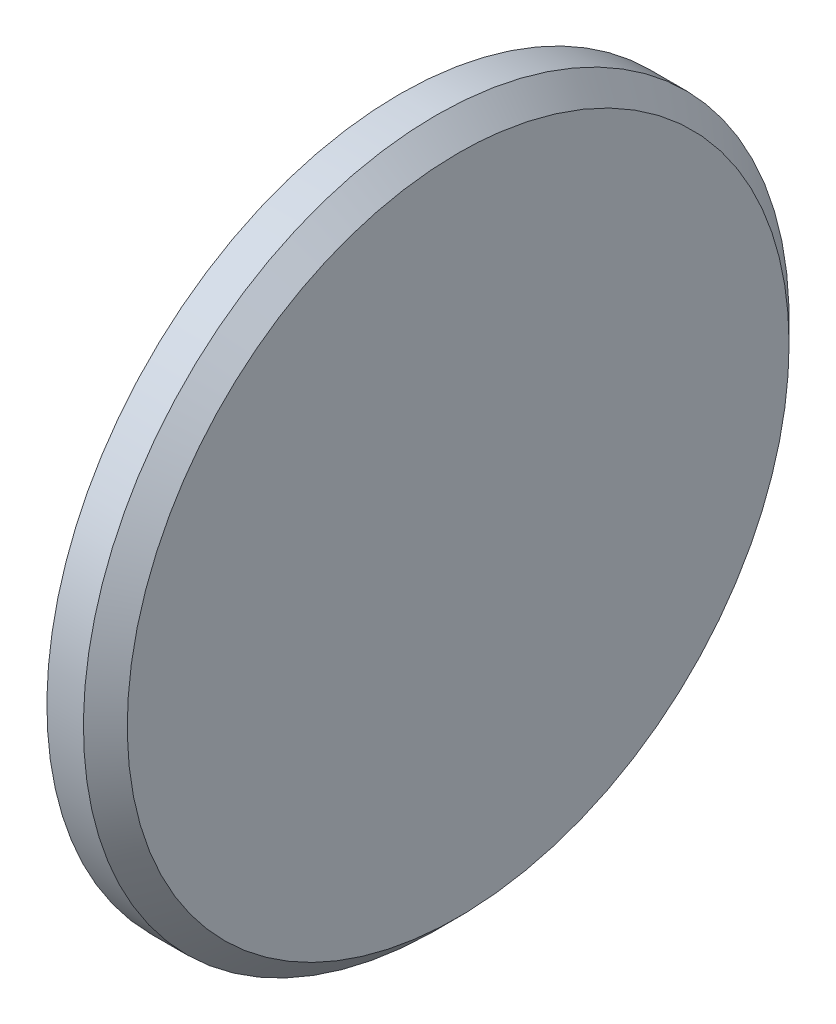
ISO-10303-21;
HEADER;
FILE_DESCRIPTION(('STEP AP214'),'2;1');
FILE_NAME('part.step','',(''),(''),'','','');
FILE_SCHEMA(('AUTOMOTIVE_DESIGN { 1 0 10303 214 1 1 1 1 }'));
ENDSEC;
DATA;
#1=APPLICATION_CONTEXT('core data for automotive mechanical design processes');
#2=APPLICATION_PROTOCOL_DEFINITION('international standard','automotive_design',2000,#1);
#3=PRODUCT_CONTEXT('',#1,'mechanical');
#4=PRODUCT('Part','Part','',(#3));
#5=PRODUCT_RELATED_PRODUCT_CATEGORY('part','',(#4));
#6=PRODUCT_DEFINITION_FORMATION('','',#4);
#7=PRODUCT_DEFINITION_CONTEXT('part definition',#1,'design');
#8=PRODUCT_DEFINITION('design','',#6,#7);
#9=PRODUCT_DEFINITION_SHAPE('','',#8);
#10=(LENGTH_UNIT() NAMED_UNIT(*) SI_UNIT(.MILLI.,.METRE.));
#11=(NAMED_UNIT(*) PLANE_ANGLE_UNIT() SI_UNIT($,.RADIAN.));
#12=(NAMED_UNIT(*) SI_UNIT($,.STERADIAN.) SOLID_ANGLE_UNIT());
#13=UNCERTAINTY_MEASURE_WITH_UNIT(LENGTH_MEASURE(1.E-05),#10,'distance_accuracy_value','');
#14=(GEOMETRIC_REPRESENTATION_CONTEXT(3) GLOBAL_UNCERTAINTY_ASSIGNED_CONTEXT((#13)) GLOBAL_UNIT_ASSIGNED_CONTEXT((#10,
#11,#12)) REPRESENTATION_CONTEXT('',''));
#15=CARTESIAN_POINT('',(0.,0.,0.));
#16=DIRECTION('',(0.,0.,1.));
#17=DIRECTION('',(1.,0.,0.));
#18=AXIS2_PLACEMENT_3D('',#15,#16,#17);
#19=CARTESIAN_POINT('',(-1.00549134612083,81.4673119679093,0.));
#20=CARTESIAN_POINT('',(-5.00549134612083,81.4673119679093,0.));
#21=CARTESIAN_POINT('',(-1.00549134612083,81.4673119679093,-41.8290270027884));
#22=CARTESIAN_POINT('',(-5.00549134612083,81.4673119679093,-41.8290270027884));
#23=CARTESIAN_POINT('',(-1.00549134612083,45.2423119679094,-20.9145135013942));
#24=CARTESIAN_POINT('',(-5.00549134612083,45.2423119679094,-20.9145135013942));
#25=CARTESIAN_POINT('',(-1.00549134612083,9.01731196790936,0.));
#26=CARTESIAN_POINT('',(-5.00549134612083,9.01731196790936,0.));
#27=CARTESIAN_POINT('',(-1.00549134612083,45.2423119679093,20.9145135013942));
#28=CARTESIAN_POINT('',(-5.00549134612083,45.2423119679093,20.9145135013942));
#29=CARTESIAN_POINT('',(-1.00549134612083,81.4673119679093,41.8290270027884));
#30=CARTESIAN_POINT('',(-5.00549134612083,81.4673119679093,41.8290270027884));
#31=CARTESIAN_POINT('',(-1.00549134612083,81.4673119679093,0.));
#32=CARTESIAN_POINT('',(-5.00549134612083,81.4673119679093,0.));
#33=(BOUNDED_SURFACE() B_SPLINE_SURFACE(2,1,((#19,#20),(#21,#22),(#23,#24),(#25,#26),(#27,#28),
(#29,#30),(#31,#32)),.UNSPECIFIED.,.T.,.F.,.F.) B_SPLINE_SURFACE_WITH_KNOTS((3,2,2,3),(2,2),(0.,
20.9145135013942,41.8290270027884,62.7435405041826),(0.,1.),
.UNSPECIFIED.) GEOMETRIC_REPRESENTATION_ITEM() RATIONAL_B_SPLINE_SURFACE(((1.,1.),(0.5,0.5),(1.,
1.),(0.5,0.5),(1.,1.),(0.5,0.5),(1.,1.))) REPRESENTATION_ITEM('') SURFACE());
#34=CARTESIAN_POINT('',(-5.00549134612083,81.4673119679093,0.));
#35=CARTESIAN_POINT('',(-2.50549134612083,81.4673119679093,0.));
#36=(BOUNDED_CURVE() B_SPLINE_CURVE(1,(#34,#35),.UNSPECIFIED.,.F.,
.F.) B_SPLINE_CURVE_WITH_KNOTS((2,2),(0.,0.625),
.UNSPECIFIED.) CURVE() GEOMETRIC_REPRESENTATION_ITEM() RATIONAL_B_SPLINE_CURVE((1.,1.)) REPRESENTATION_ITEM(''));
#37=CARTESIAN_POINT('',(-5.00549134612083,81.4673119679093,0.));
#38=VERTEX_POINT('',#37);
#39=CARTESIAN_POINT('',(-2.50549134612083,81.4673119679093,0.));
#40=VERTEX_POINT('',#39);
#41=EDGE_CURVE('E11',#38,#40,#36,.T.);
#42=CARTESIAN_POINT('',(-5.00549134612083,81.4673119679093,0.));
#43=CARTESIAN_POINT('',(-5.00549134612083,81.4673119679093,-41.8290270027884));
#44=CARTESIAN_POINT('',(-5.00549134612083,45.2423119679094,-20.9145135013942));
#45=CARTESIAN_POINT('',(-5.00549134612083,9.01731196790936,0.));
#46=CARTESIAN_POINT('',(-5.00549134612083,45.2423119679093,20.9145135013942));
#47=CARTESIAN_POINT('',(-5.00549134612083,81.4673119679093,41.8290270027884));
#48=CARTESIAN_POINT('',(-5.00549134612083,81.4673119679093,0.));
#49=(BOUNDED_CURVE() B_SPLINE_CURVE(2,(#42,#43,#44,#45,#46,#47,#48),.UNSPECIFIED.,.T.,
.F.) B_SPLINE_CURVE_WITH_KNOTS((3,2,2,3),(0.,0.333333333333333,0.666666666666667,1.),
.UNSPECIFIED.) CURVE() GEOMETRIC_REPRESENTATION_ITEM() RATIONAL_B_SPLINE_CURVE((1.,0.5,1.,0.5,
1.,0.5,1.)) REPRESENTATION_ITEM(''));
#50=EDGE_CURVE('E28',#38,#38,#49,.T.);
#51=CARTESIAN_POINT('',(-2.50549134612083,81.4673119679093,0.));
#52=CARTESIAN_POINT('',(-2.50549134612083,81.4673119679093,-41.8290270027884));
#53=CARTESIAN_POINT('',(-2.50549134612083,45.2423119679094,-20.9145135013942));
#54=CARTESIAN_POINT('',(-2.50549134612083,9.01731196790936,0.));
#55=CARTESIAN_POINT('',(-2.50549134612083,45.2423119679094,20.9145135013942));
#56=CARTESIAN_POINT('',(-2.50549134612083,81.4673119679093,41.8290270027884));
#57=CARTESIAN_POINT('',(-2.50549134612083,81.4673119679093,0.));
#58=(BOUNDED_CURVE() B_SPLINE_CURVE(2,(#51,#52,#53,#54,#55,#56,#57),.UNSPECIFIED.,.T.,
.F.) B_SPLINE_CURVE_WITH_KNOTS((3,2,2,3),(2.,24.3625107887304,46.7250215774608,
69.0875323661913),
.UNSPECIFIED.) CURVE() GEOMETRIC_REPRESENTATION_ITEM() RATIONAL_B_SPLINE_CURVE((1.,0.5,1.,0.5,
1.,0.5,1.)) REPRESENTATION_ITEM(''));
#59=EDGE_CURVE('E55',#40,#40,#58,.T.);
#60=ORIENTED_EDGE('',*,*,#41,.F.);
#61=ORIENTED_EDGE('',*,*,#50,.F.);
#62=ORIENTED_EDGE('',*,*,#41,.T.);
#63=ORIENTED_EDGE('',*,*,#59,.T.);
#64=EDGE_LOOP('',(#60,#61,#62,#63));
#65=FACE_BOUND('',#64,.T.);
#66=ADVANCED_FACE('F16',(#65),#33,.T.);
#67=CARTESIAN_POINT('',(-5.00549134612083,30.7523119679093,-26.565));
#68=CARTESIAN_POINT('',(-5.00549134612083,83.8823119679093,-26.565));
#69=CARTESIAN_POINT('',(-5.00549134612083,30.7523119679093,26.565));
#70=CARTESIAN_POINT('',(-5.00549134612083,83.8823119679093,26.565));
#71=(BOUNDED_SURFACE() B_SPLINE_SURFACE(1,1,((#67,#68),(#69,#70)),.UNSPECIFIED.,.F.,.F.,
.F.) B_SPLINE_SURFACE_WITH_KNOTS((2,2),(2,2),(0.,1.),(0.,1.),
.UNSPECIFIED.) GEOMETRIC_REPRESENTATION_ITEM() RATIONAL_B_SPLINE_SURFACE(((1.,1.),(1.,1.))) REPRESENTATION_ITEM('') SURFACE());
#72=ORIENTED_EDGE('',*,*,#50,.T.);
#73=EDGE_LOOP('',(#72));
#74=FACE_BOUND('',#73,.T.);
#75=ADVANCED_FACE('F89',(#74),#71,.T.);
#76=CARTESIAN_POINT('',(-1.00549134612083,83.8823119679093,-26.565));
#77=CARTESIAN_POINT('',(-1.00549134612083,30.7523119679093,-26.565));
#78=CARTESIAN_POINT('',(-1.00549134612083,83.8823119679093,26.565));
#79=CARTESIAN_POINT('',(-1.00549134612083,30.7523119679093,26.565));
#80=(BOUNDED_SURFACE() B_SPLINE_SURFACE(1,1,((#76,#77),(#78,#79)),.UNSPECIFIED.,.F.,.F.,
.F.) B_SPLINE_SURFACE_WITH_KNOTS((2,2),(2,2),(0.,1.),(0.,1.),
.UNSPECIFIED.) GEOMETRIC_REPRESENTATION_ITEM() RATIONAL_B_SPLINE_SURFACE(((1.,1.),(1.,1.))) REPRESENTATION_ITEM('') SURFACE());
#81=CARTESIAN_POINT('',(-1.00549134612083,79.9673119679093,0.));
#82=CARTESIAN_POINT('',(-1.00549134612083,79.9673119679093,39.2309507914351));
#83=CARTESIAN_POINT('',(-1.00549134612083,45.9923119679094,19.6154753957176));
#84=CARTESIAN_POINT('',(-1.00549134612083,12.0173119679094,0.));
#85=CARTESIAN_POINT('',(-1.00549134612083,45.9923119679094,-19.6154753957175));
#86=CARTESIAN_POINT('',(-1.00549134612083,79.9673119679093,-39.2309507914351));
#87=CARTESIAN_POINT('',(-1.00549134612083,79.9673119679093,0.));
#88=(BOUNDED_CURVE() B_SPLINE_CURVE(2,(#81,#82,#83,#84,#85,#86,#87),.UNSPECIFIED.,.T.,
.F.) B_SPLINE_CURVE_WITH_KNOTS((3,2,2,3),(2.,24.3625107887304,46.7250215774608,
69.0875323661913),
.UNSPECIFIED.) CURVE() GEOMETRIC_REPRESENTATION_ITEM() RATIONAL_B_SPLINE_CURVE((1.,0.5,1.,0.5,
1.,0.5,1.)) REPRESENTATION_ITEM(''));
#89=CARTESIAN_POINT('',(-1.00549134612083,79.9673119679093,0.));
#90=VERTEX_POINT('',#89);
#91=EDGE_CURVE('E48',#90,#90,#88,.T.);
#92=ORIENTED_EDGE('',*,*,#91,.T.);
#93=EDGE_LOOP('',(#92));
#94=FACE_BOUND('',#93,.T.);
#95=ADVANCED_FACE('F91',(#94),#80,.T.);
#96=CARTESIAN_POINT('',(-2.50549134612083,81.4673119679093,0.));
#97=CARTESIAN_POINT('',(-1.00549134612083,79.9673119679093,0.));
#98=CARTESIAN_POINT('',(-2.50549134612083,81.4673119679093,41.8290270027884));
#99=CARTESIAN_POINT('',(-1.00549134612083,79.9673119679093,39.2309507914351));
#100=CARTESIAN_POINT('',(-2.50549134612083,45.2423119679094,20.9145135013942));
#101=CARTESIAN_POINT('',(-1.00549134612083,45.9923119679094,19.6154753957176));
#102=CARTESIAN_POINT('',(-2.50549134612083,9.01731196790936,0.));
#103=CARTESIAN_POINT('',(-1.00549134612083,12.0173119679094,0.));
#104=CARTESIAN_POINT('',(-2.50549134612083,45.2423119679094,-20.9145135013942));
#105=CARTESIAN_POINT('',(-1.00549134612083,45.9923119679094,-19.6154753957175));
#106=CARTESIAN_POINT('',(-2.50549134612083,81.4673119679093,-41.8290270027884));
#107=CARTESIAN_POINT('',(-1.00549134612083,79.9673119679093,-39.2309507914351));
#108=CARTESIAN_POINT('',(-2.50549134612083,81.4673119679093,0.));
#109=CARTESIAN_POINT('',(-1.00549134612083,79.9673119679093,0.));
#110=(BOUNDED_SURFACE() B_SPLINE_SURFACE(2,1,((#96,#97),(#98,#99),(#100,#101),(#102,#103),(#104,
#105),(#106,#107),(#108,#109)),.UNSPECIFIED.,.T.,.F.,.F.) B_SPLINE_SURFACE_WITH_KNOTS((3,2,2,3),
(2,2),(2.,24.3625107887304,46.7250215774608,69.0875323661913),(0.,1.),
.UNSPECIFIED.) GEOMETRIC_REPRESENTATION_ITEM() RATIONAL_B_SPLINE_SURFACE(((1.,1.),(0.5,0.5),(1.,
1.),(0.5,0.5),(1.,1.),(0.5,0.5),(1.,1.))) REPRESENTATION_ITEM('') SURFACE());
#111=CARTESIAN_POINT('',(-1.00549134612083,79.9673119679093,0.));
#112=CARTESIAN_POINT('',(-2.50549134612083,81.4673119679093,0.));
#113=(BOUNDED_CURVE() B_SPLINE_CURVE(1,(#111,#112),.UNSPECIFIED.,.F.,
.F.) B_SPLINE_CURVE_WITH_KNOTS((2,2),(0.,1.),
.UNSPECIFIED.) CURVE() GEOMETRIC_REPRESENTATION_ITEM() RATIONAL_B_SPLINE_CURVE((1.,1.)) REPRESENTATION_ITEM(''));
#114=EDGE_CURVE('E58',#90,#40,#113,.T.);
#115=ORIENTED_EDGE('',*,*,#59,.F.);
#116=ORIENTED_EDGE('',*,*,#114,.F.);
#117=ORIENTED_EDGE('',*,*,#91,.F.);
#118=ORIENTED_EDGE('',*,*,#114,.T.);
#119=EDGE_LOOP('',(#115,#116,#117,#118));
#120=FACE_BOUND('',#119,.T.);
#121=ADVANCED_FACE('F59',(#120),#110,.T.);
#122=CLOSED_SHELL('',(#66,#75,#95,#121));
#123=MANIFOLD_SOLID_BREP('B1',#122);
#124=ADVANCED_BREP_SHAPE_REPRESENTATION('',(#18,#123),#14);
#125=SHAPE_DEFINITION_REPRESENTATION(#9,#124);
ENDSEC;
END-ISO-10303-21;
